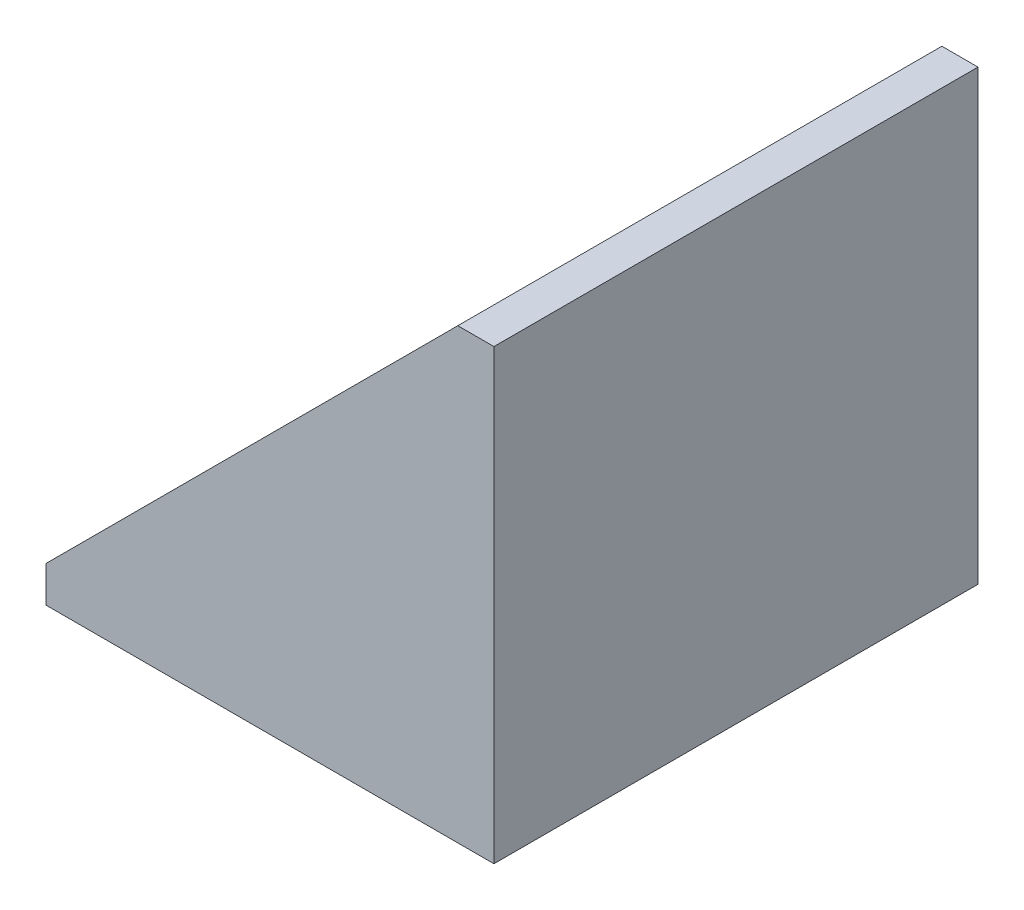
ISO-10303-21;
HEADER;
FILE_DESCRIPTION(('STEP AP214'),'2;1');
FILE_NAME('part.step','',(''),(''),'','','');
FILE_SCHEMA(('AUTOMOTIVE_DESIGN { 1 0 10303 214 1 1 1 1 }'));
ENDSEC;
DATA;
#1=APPLICATION_CONTEXT('core data for automotive mechanical design processes');
#2=APPLICATION_PROTOCOL_DEFINITION('international standard','automotive_design',2000,#1);
#3=PRODUCT_CONTEXT('',#1,'mechanical');
#4=PRODUCT('Part','Part','',(#3));
#5=PRODUCT_RELATED_PRODUCT_CATEGORY('part','',(#4));
#6=PRODUCT_DEFINITION_FORMATION('','',#4);
#7=PRODUCT_DEFINITION_CONTEXT('part definition',#1,'design');
#8=PRODUCT_DEFINITION('design','',#6,#7);
#9=PRODUCT_DEFINITION_SHAPE('','',#8);
#10=(LENGTH_UNIT() NAMED_UNIT(*) SI_UNIT(.MILLI.,.METRE.));
#11=(NAMED_UNIT(*) PLANE_ANGLE_UNIT() SI_UNIT($,.RADIAN.));
#12=(NAMED_UNIT(*) SI_UNIT($,.STERADIAN.) SOLID_ANGLE_UNIT());
#13=UNCERTAINTY_MEASURE_WITH_UNIT(LENGTH_MEASURE(1.E-05),#10,'distance_accuracy_value','');
#14=(GEOMETRIC_REPRESENTATION_CONTEXT(3) GLOBAL_UNCERTAINTY_ASSIGNED_CONTEXT((#13)) GLOBAL_UNIT_ASSIGNED_CONTEXT((#10,
#11,#12)) REPRESENTATION_CONTEXT('',''));
#15=CARTESIAN_POINT('',(0.,0.,0.));
#16=DIRECTION('',(0.,0.,1.));
#17=DIRECTION('',(1.,0.,0.));
#18=AXIS2_PLACEMENT_3D('',#15,#16,#17);
#19=CARTESIAN_POINT('',(0.,5.,0.));
#20=DIRECTION('',(0.,-1.,0.));
#21=DIRECTION('',(0.,0.,-1.));
#22=AXIS2_PLACEMENT_3D('',#19,#20,#21);
#23=PLANE('',#22);
#24=DIRECTION('',(0.,0.,-1.));
#25=VECTOR('',#24,1.);
#26=CARTESIAN_POINT('',(28.5,5.,28.5));
#27=LINE('',#26,#25);
#28=CARTESIAN_POINT('',(28.5,5.,28.5));
#29=VERTEX_POINT('',#28);
#30=CARTESIAN_POINT('',(28.5,5.,-28.5));
#31=VERTEX_POINT('',#30);
#32=EDGE_CURVE('E199',#29,#31,#27,.T.);
#33=ORIENTED_EDGE('',*,*,#32,.T.);
#34=DIRECTION('',(-1.,0.,0.));
#35=VECTOR('',#34,1.);
#36=CARTESIAN_POINT('',(-28.5,5.,-28.5));
#37=LINE('',#36,#35);
#38=CARTESIAN_POINT('',(-28.5,5.,-28.5));
#39=VERTEX_POINT('',#38);
#40=EDGE_CURVE('E49',#31,#39,#37,.T.);
#41=ORIENTED_EDGE('',*,*,#40,.T.);
#42=DIRECTION('',(0.,0.,1.));
#43=VECTOR('',#42,1.);
#44=CARTESIAN_POINT('',(-28.5,5.,28.5));
#45=LINE('',#44,#43);
#46=CARTESIAN_POINT('',(-28.5,5.,28.5));
#47=VERTEX_POINT('',#46);
#48=EDGE_CURVE('E42',#39,#47,#45,.T.);
#49=ORIENTED_EDGE('',*,*,#48,.T.);
#50=DIRECTION('',(1.,0.,0.));
#51=VECTOR('',#50,1.);
#52=CARTESIAN_POINT('',(-28.5,5.,28.5));
#53=LINE('',#52,#51);
#54=EDGE_CURVE('E11',#47,#29,#53,.T.);
#55=ORIENTED_EDGE('',*,*,#54,.T.);
#56=EDGE_LOOP('',(#33,#41,#49,#55));
#57=FACE_BOUND('',#56,.T.);
#58=CARTESIAN_POINT('',(-23.55,5.,-23.55));
#59=DIRECTION('',(0.,1.,0.));
#60=DIRECTION('',(0.,0.,1.));
#61=AXIS2_PLACEMENT_3D('',#58,#59,#60);
#62=CIRCLE('',#61,2.5);
#63=CARTESIAN_POINT('',(-23.55,5.,-21.05));
#64=VERTEX_POINT('',#63);
#65=EDGE_CURVE('E194',#64,#64,#62,.T.);
#66=ORIENTED_EDGE('',*,*,#65,.F.);
#67=EDGE_LOOP('',(#66));
#68=FACE_BOUND('',#67,.T.);
#69=CARTESIAN_POINT('',(0.,5.,0.));
#70=DIRECTION('',(0.,1.,0.));
#71=DIRECTION('',(0.,0.,1.));
#72=AXIS2_PLACEMENT_3D('',#69,#70,#71);
#73=CIRCLE('',#72,19.2);
#74=CARTESIAN_POINT('',(0.,5.,19.2));
#75=VERTEX_POINT('',#74);
#76=EDGE_CURVE('E188',#75,#75,#73,.T.);
#77=ORIENTED_EDGE('',*,*,#76,.F.);
#78=EDGE_LOOP('',(#77));
#79=FACE_BOUND('',#78,.T.);
#80=CARTESIAN_POINT('',(23.55,5.,-23.5500000000013));
#81=DIRECTION('',(0.,1.,0.));
#82=DIRECTION('',(0.,0.,1.));
#83=AXIS2_PLACEMENT_3D('',#80,#81,#82);
#84=CIRCLE('',#83,2.5);
#85=CARTESIAN_POINT('',(23.55,5.,-21.0500000000013));
#86=VERTEX_POINT('',#85);
#87=EDGE_CURVE('E182',#86,#86,#84,.T.);
#88=ORIENTED_EDGE('',*,*,#87,.F.);
#89=EDGE_LOOP('',(#88));
#90=FACE_BOUND('',#89,.T.);
#91=CARTESIAN_POINT('',(23.5500000000013,5.,23.5499999999987));
#92=DIRECTION('',(0.,1.,0.));
#93=DIRECTION('',(0.,0.,1.));
#94=AXIS2_PLACEMENT_3D('',#91,#92,#93);
#95=CIRCLE('',#94,2.5);
#96=CARTESIAN_POINT('',(23.5500000000013,5.,26.0499999999987));
#97=VERTEX_POINT('',#96);
#98=EDGE_CURVE('E176',#97,#97,#95,.T.);
#99=ORIENTED_EDGE('',*,*,#98,.F.);
#100=EDGE_LOOP('',(#99));
#101=FACE_BOUND('',#100,.T.);
#102=CARTESIAN_POINT('',(-23.5499999999987,5.,23.55));
#103=DIRECTION('',(0.,1.,0.));
#104=DIRECTION('',(0.,0.,1.));
#105=AXIS2_PLACEMENT_3D('',#102,#103,#104);
#106=CIRCLE('',#105,2.5);
#107=CARTESIAN_POINT('',(-23.5499999999987,5.,26.05));
#108=VERTEX_POINT('',#107);
#109=EDGE_CURVE('E170',#108,#108,#106,.T.);
#110=ORIENTED_EDGE('',*,*,#109,.F.);
#111=EDGE_LOOP('',(#110));
#112=FACE_BOUND('',#111,.T.);
#113=ADVANCED_FACE('F33',(#57,#68,#79,#90,#101,#112),#23,.F.);
#114=CARTESIAN_POINT('',(0.,0.,0.));
#115=DIRECTION('',(0.,-1.,0.));
#116=DIRECTION('',(0.,0.,-1.));
#117=AXIS2_PLACEMENT_3D('',#114,#115,#116);
#118=PLANE('',#117);
#119=CARTESIAN_POINT('',(23.5500000000013,0.,23.5499999999987));
#120=DIRECTION('',(0.,1.,0.));
#121=DIRECTION('',(0.,0.,1.));
#122=AXIS2_PLACEMENT_3D('',#119,#120,#121);
#123=CIRCLE('',#122,2.5);
#124=CARTESIAN_POINT('',(23.5500000000013,0.,26.0499999999987));
#125=VERTEX_POINT('',#124);
#126=EDGE_CURVE('E173',#125,#125,#123,.T.);
#127=ORIENTED_EDGE('',*,*,#126,.T.);
#128=EDGE_LOOP('',(#127));
#129=FACE_BOUND('',#128,.T.);
#130=CARTESIAN_POINT('',(0.,0.,0.));
#131=DIRECTION('',(0.,1.,0.));
#132=DIRECTION('',(0.,0.,1.));
#133=AXIS2_PLACEMENT_3D('',#130,#131,#132);
#134=CIRCLE('',#133,19.2);
#135=CARTESIAN_POINT('',(0.,0.,19.2));
#136=VERTEX_POINT('',#135);
#137=EDGE_CURVE('E185',#136,#136,#134,.T.);
#138=ORIENTED_EDGE('',*,*,#137,.T.);
#139=EDGE_LOOP('',(#138));
#140=FACE_BOUND('',#139,.T.);
#141=DIRECTION('',(0.,0.,1.));
#142=VECTOR('',#141,1.);
#143=CARTESIAN_POINT('',(-28.5,0.,28.5));
#144=LINE('',#143,#142);
#145=CARTESIAN_POINT('',(-28.5,0.,-33.5));
#146=VERTEX_POINT('',#145);
#147=CARTESIAN_POINT('',(-28.5,0.,33.5));
#148=VERTEX_POINT('',#147);
#149=EDGE_CURVE('E37',#146,#148,#144,.T.);
#150=ORIENTED_EDGE('',*,*,#149,.F.);
#151=DIRECTION('',(1.,0.,0.));
#152=VECTOR('',#151,1.);
#153=CARTESIAN_POINT('',(-28.5,0.,-33.5));
#154=LINE('',#153,#152);
#155=CARTESIAN_POINT('',(33.5,0.,-33.5));
#156=VERTEX_POINT('',#155);
#157=EDGE_CURVE('E133',#146,#156,#154,.T.);
#158=ORIENTED_EDGE('',*,*,#157,.T.);
#159=DIRECTION('',(0.,0.,1.));
#160=VECTOR('',#159,1.);
#161=CARTESIAN_POINT('',(33.5,0.,-90.7012861603359));
#162=LINE('',#161,#160);
#163=CARTESIAN_POINT('',(33.5,0.,33.5));
#164=VERTEX_POINT('',#163);
#165=EDGE_CURVE('E166',#156,#164,#162,.T.);
#166=ORIENTED_EDGE('',*,*,#165,.T.);
#167=DIRECTION('',(1.,0.,0.));
#168=VECTOR('',#167,1.);
#169=CARTESIAN_POINT('',(-28.5,0.,33.5));
#170=LINE('',#169,#168);
#171=EDGE_CURVE('E147',#148,#164,#170,.T.);
#172=ORIENTED_EDGE('',*,*,#171,.F.);
#173=EDGE_LOOP('',(#150,#158,#166,#172));
#174=FACE_BOUND('',#173,.T.);
#175=CARTESIAN_POINT('',(-23.55,0.,-23.55));
#176=DIRECTION('',(0.,1.,0.));
#177=DIRECTION('',(0.,0.,1.));
#178=AXIS2_PLACEMENT_3D('',#175,#176,#177);
#179=CIRCLE('',#178,2.5);
#180=CARTESIAN_POINT('',(-23.55,0.,-21.05));
#181=VERTEX_POINT('',#180);
#182=EDGE_CURVE('E191',#181,#181,#179,.T.);
#183=ORIENTED_EDGE('',*,*,#182,.T.);
#184=EDGE_LOOP('',(#183));
#185=FACE_BOUND('',#184,.T.);
#186=CARTESIAN_POINT('',(23.55,0.,-23.5500000000013));
#187=DIRECTION('',(0.,1.,0.));
#188=DIRECTION('',(0.,0.,1.));
#189=AXIS2_PLACEMENT_3D('',#186,#187,#188);
#190=CIRCLE('',#189,2.5);
#191=CARTESIAN_POINT('',(23.55,0.,-21.0500000000013));
#192=VERTEX_POINT('',#191);
#193=EDGE_CURVE('E179',#192,#192,#190,.T.);
#194=ORIENTED_EDGE('',*,*,#193,.T.);
#195=EDGE_LOOP('',(#194));
#196=FACE_BOUND('',#195,.T.);
#197=CARTESIAN_POINT('',(-23.5499999999987,0.,23.55));
#198=DIRECTION('',(0.,1.,0.));
#199=DIRECTION('',(0.,0.,1.));
#200=AXIS2_PLACEMENT_3D('',#197,#198,#199);
#201=CIRCLE('',#200,2.5);
#202=CARTESIAN_POINT('',(-23.5499999999987,0.,26.05));
#203=VERTEX_POINT('',#202);
#204=EDGE_CURVE('E163',#203,#203,#201,.T.);
#205=ORIENTED_EDGE('',*,*,#204,.T.);
#206=EDGE_LOOP('',(#205));
#207=FACE_BOUND('',#206,.T.);
#208=ADVANCED_FACE('F221',(#129,#140,#174,#185,#196,#207),#118,.T.);
#209=CARTESIAN_POINT('',(-28.5,5.,28.5));
#210=DIRECTION('',(1.,0.,0.));
#211=DIRECTION('',(0.,0.,-1.));
#212=AXIS2_PLACEMENT_3D('',#209,#210,#211);
#213=PLANE('',#212);
#214=ORIENTED_EDGE('',*,*,#149,.T.);
#215=DIRECTION('',(0.,-1.,0.));
#216=VECTOR('',#215,1.);
#217=CARTESIAN_POINT('',(-28.5,5.,33.5));
#218=LINE('',#217,#216);
#219=CARTESIAN_POINT('',(-28.5,5.,33.5));
#220=VERTEX_POINT('',#219);
#221=EDGE_CURVE('E144',#220,#148,#218,.T.);
#222=ORIENTED_EDGE('',*,*,#221,.F.);
#223=DIRECTION('',(0.,0.,-1.));
#224=VECTOR('',#223,1.);
#225=CARTESIAN_POINT('',(-28.5,5.,33.5));
#226=LINE('',#225,#224);
#227=EDGE_CURVE('E153',#220,#47,#226,.T.);
#228=ORIENTED_EDGE('',*,*,#227,.T.);
#229=ORIENTED_EDGE('',*,*,#48,.F.);
#230=DIRECTION('',(0.,0.,1.));
#231=VECTOR('',#230,1.);
#232=CARTESIAN_POINT('',(-28.5,5.,-33.5));
#233=LINE('',#232,#231);
#234=CARTESIAN_POINT('',(-28.5,5.,-33.5));
#235=VERTEX_POINT('',#234);
#236=EDGE_CURVE('E112',#235,#39,#233,.T.);
#237=ORIENTED_EDGE('',*,*,#236,.F.);
#238=DIRECTION('',(0.,-1.,0.));
#239=VECTOR('',#238,1.);
#240=CARTESIAN_POINT('',(-28.5,5.,-33.5));
#241=LINE('',#240,#239);
#242=EDGE_CURVE('E124',#235,#146,#241,.T.);
#243=ORIENTED_EDGE('',*,*,#242,.T.);
#244=EDGE_LOOP('',(#214,#222,#228,#229,#237,#243));
#245=FACE_BOUND('',#244,.T.);
#246=ADVANCED_FACE('F35',(#245),#213,.F.);
#247=CARTESIAN_POINT('',(-23.55,5.,-23.55));
#248=DIRECTION('',(0.,-1.,0.));
#249=DIRECTION('',(0.,0.,-1.));
#250=AXIS2_PLACEMENT_3D('',#247,#248,#249);
#251=CYLINDRICAL_SURFACE('',#250,2.5);
#252=ORIENTED_EDGE('',*,*,#65,.T.);
#253=EDGE_LOOP('',(#252));
#254=FACE_BOUND('',#253,.T.);
#255=ORIENTED_EDGE('',*,*,#182,.F.);
#256=EDGE_LOOP('',(#255));
#257=FACE_BOUND('',#256,.T.);
#258=ADVANCED_FACE('F228',(#254,#257),#251,.F.);
#259=CARTESIAN_POINT('',(0.,5.,0.));
#260=DIRECTION('',(0.,-1.,0.));
#261=DIRECTION('',(0.,0.,-1.));
#262=AXIS2_PLACEMENT_3D('',#259,#260,#261);
#263=CYLINDRICAL_SURFACE('',#262,19.2);
#264=ORIENTED_EDGE('',*,*,#76,.T.);
#265=EDGE_LOOP('',(#264));
#266=FACE_BOUND('',#265,.T.);
#267=ORIENTED_EDGE('',*,*,#137,.F.);
#268=EDGE_LOOP('',(#267));
#269=FACE_BOUND('',#268,.T.);
#270=ADVANCED_FACE('F231',(#266,#269),#263,.F.);
#271=CARTESIAN_POINT('',(23.55,5.,-23.5500000000013));
#272=DIRECTION('',(0.,-1.,0.));
#273=DIRECTION('',(0.,0.,-1.));
#274=AXIS2_PLACEMENT_3D('',#271,#272,#273);
#275=CYLINDRICAL_SURFACE('',#274,2.5);
#276=ORIENTED_EDGE('',*,*,#87,.T.);
#277=EDGE_LOOP('',(#276));
#278=FACE_BOUND('',#277,.T.);
#279=ORIENTED_EDGE('',*,*,#193,.F.);
#280=EDGE_LOOP('',(#279));
#281=FACE_BOUND('',#280,.T.);
#282=ADVANCED_FACE('F235',(#278,#281),#275,.F.);
#283=CARTESIAN_POINT('',(23.5500000000013,5.,23.5499999999987));
#284=DIRECTION('',(0.,-1.,0.));
#285=DIRECTION('',(0.,0.,-1.));
#286=AXIS2_PLACEMENT_3D('',#283,#284,#285);
#287=CYLINDRICAL_SURFACE('',#286,2.5);
#288=ORIENTED_EDGE('',*,*,#98,.T.);
#289=EDGE_LOOP('',(#288));
#290=FACE_BOUND('',#289,.T.);
#291=ORIENTED_EDGE('',*,*,#126,.F.);
#292=EDGE_LOOP('',(#291));
#293=FACE_BOUND('',#292,.T.);
#294=ADVANCED_FACE('F239',(#290,#293),#287,.F.);
#295=CARTESIAN_POINT('',(-23.5499999999987,5.,23.55));
#296=DIRECTION('',(0.,-1.,0.));
#297=DIRECTION('',(0.,0.,-1.));
#298=AXIS2_PLACEMENT_3D('',#295,#296,#297);
#299=CYLINDRICAL_SURFACE('',#298,2.5);
#300=ORIENTED_EDGE('',*,*,#109,.T.);
#301=EDGE_LOOP('',(#300));
#302=FACE_BOUND('',#301,.T.);
#303=ORIENTED_EDGE('',*,*,#204,.F.);
#304=EDGE_LOOP('',(#303));
#305=FACE_BOUND('',#304,.T.);
#306=ADVANCED_FACE('F243',(#302,#305),#299,.F.);
#307=CARTESIAN_POINT('',(28.5,62.,-90.7012861603359));
#308=DIRECTION('',(-1.,0.,0.));
#309=DIRECTION('',(0.,0.,1.));
#310=AXIS2_PLACEMENT_3D('',#307,#308,#309);
#311=PLANE('',#310);
#312=ORIENTED_EDGE('',*,*,#32,.F.);
#313=DIRECTION('',(0.,-1.,0.));
#314=VECTOR('',#313,1.);
#315=CARTESIAN_POINT('',(28.5,62.,28.5));
#316=LINE('',#315,#314);
#317=CARTESIAN_POINT('',(28.5,62.,28.5));
#318=VERTEX_POINT('',#317);
#319=EDGE_CURVE('E161',#318,#29,#316,.T.);
#320=ORIENTED_EDGE('',*,*,#319,.F.);
#321=DIRECTION('',(0.,0.,1.));
#322=VECTOR('',#321,1.);
#323=CARTESIAN_POINT('',(28.5,62.,-90.7012861603359));
#324=LINE('',#323,#322);
#325=CARTESIAN_POINT('',(28.5,62.,-28.5));
#326=VERTEX_POINT('',#325);
#327=EDGE_CURVE('E164',#326,#318,#324,.T.);
#328=ORIENTED_EDGE('',*,*,#327,.F.);
#329=DIRECTION('',(0.,1.,0.));
#330=VECTOR('',#329,1.);
#331=CARTESIAN_POINT('',(28.5,62.,-28.5));
#332=LINE('',#331,#330);
#333=EDGE_CURVE('E57',#31,#326,#332,.T.);
#334=ORIENTED_EDGE('',*,*,#333,.F.);
#335=EDGE_LOOP('',(#312,#320,#328,#334));
#336=FACE_BOUND('',#335,.T.);
#337=ADVANCED_FACE('F247',(#336),#311,.T.);
#338=CARTESIAN_POINT('',(28.5,62.,-90.7012861603359));
#339=DIRECTION('',(0.,1.,0.));
#340=DIRECTION('',(0.,0.,1.));
#341=AXIS2_PLACEMENT_3D('',#338,#339,#340);
#342=PLANE('',#341);
#343=DIRECTION('',(0.,0.,1.));
#344=VECTOR('',#343,1.);
#345=CARTESIAN_POINT('',(33.5,62.,-90.7012861603359));
#346=LINE('',#345,#344);
#347=CARTESIAN_POINT('',(33.5,62.,-33.5));
#348=VERTEX_POINT('',#347);
#349=CARTESIAN_POINT('',(33.5,62.,33.5));
#350=VERTEX_POINT('',#349);
#351=EDGE_CURVE('E128',#348,#350,#346,.T.);
#352=ORIENTED_EDGE('',*,*,#351,.F.);
#353=DIRECTION('',(-1.,0.,0.));
#354=VECTOR('',#353,1.);
#355=CARTESIAN_POINT('',(33.5,62.,-33.5));
#356=LINE('',#355,#354);
#357=CARTESIAN_POINT('',(28.5,62.,-33.5));
#358=VERTEX_POINT('',#357);
#359=EDGE_CURVE('E120',#348,#358,#356,.T.);
#360=ORIENTED_EDGE('',*,*,#359,.T.);
#361=DIRECTION('',(0.,0.,1.));
#362=VECTOR('',#361,1.);
#363=CARTESIAN_POINT('',(28.5,62.,-33.5));
#364=LINE('',#363,#362);
#365=EDGE_CURVE('E102',#358,#326,#364,.T.);
#366=ORIENTED_EDGE('',*,*,#365,.T.);
#367=ORIENTED_EDGE('',*,*,#327,.T.);
#368=DIRECTION('',(0.,0.,-1.));
#369=VECTOR('',#368,1.);
#370=CARTESIAN_POINT('',(28.5,62.,33.5));
#371=LINE('',#370,#369);
#372=CARTESIAN_POINT('',(28.5,62.,33.5));
#373=VERTEX_POINT('',#372);
#374=EDGE_CURVE('E158',#373,#318,#371,.T.);
#375=ORIENTED_EDGE('',*,*,#374,.F.);
#376=DIRECTION('',(-1.,0.,0.));
#377=VECTOR('',#376,1.);
#378=CARTESIAN_POINT('',(33.5,62.,33.5));
#379=LINE('',#378,#377);
#380=EDGE_CURVE('E139',#350,#373,#379,.T.);
#381=ORIENTED_EDGE('',*,*,#380,.F.);
#382=EDGE_LOOP('',(#352,#360,#366,#367,#375,#381));
#383=FACE_BOUND('',#382,.T.);
#384=ADVANCED_FACE('F126',(#383),#342,.T.);
#385=CARTESIAN_POINT('',(33.5,62.,-90.7012861603359));
#386=DIRECTION('',(1.,0.,0.));
#387=DIRECTION('',(0.,1.,0.));
#388=AXIS2_PLACEMENT_3D('',#385,#386,#387);
#389=PLANE('',#388);
#390=ORIENTED_EDGE('',*,*,#165,.F.);
#391=DIRECTION('',(0.,1.,0.));
#392=VECTOR('',#391,1.);
#393=CARTESIAN_POINT('',(33.5,0.,-33.5));
#394=LINE('',#393,#392);
#395=EDGE_CURVE('E113',#156,#348,#394,.T.);
#396=ORIENTED_EDGE('',*,*,#395,.T.);
#397=ORIENTED_EDGE('',*,*,#351,.T.);
#398=DIRECTION('',(0.,1.,0.));
#399=VECTOR('',#398,1.);
#400=CARTESIAN_POINT('',(33.5,0.,33.5));
#401=LINE('',#400,#399);
#402=EDGE_CURVE('E150',#164,#350,#401,.T.);
#403=ORIENTED_EDGE('',*,*,#402,.F.);
#404=EDGE_LOOP('',(#390,#396,#397,#403));
#405=FACE_BOUND('',#404,.T.);
#406=ADVANCED_FACE('F251',(#405),#389,.T.);
#407=CARTESIAN_POINT('',(0.,0.,28.5));
#408=DIRECTION('',(0.,0.,1.));
#409=DIRECTION('',(1.,0.,0.));
#410=AXIS2_PLACEMENT_3D('',#407,#408,#409);
#411=PLANE('',#410);
#412=DIRECTION('',(-0.707106781186548,-0.707106781186548,0.));
#413=VECTOR('',#412,1.);
#414=CARTESIAN_POINT('',(28.5,62.,28.5));
#415=LINE('',#414,#413);
#416=EDGE_CURVE('E137',#318,#47,#415,.T.);
#417=ORIENTED_EDGE('',*,*,#416,.F.);
#418=ORIENTED_EDGE('',*,*,#319,.T.);
#419=ORIENTED_EDGE('',*,*,#54,.F.);
#420=EDGE_LOOP('',(#417,#418,#419));
#421=FACE_BOUND('',#420,.T.);
#422=ADVANCED_FACE('F254',(#421),#411,.F.);
#423=CARTESIAN_POINT('',(28.5,62.,33.5));
#424=DIRECTION('',(0.707106781186548,-0.707106781186548,0.));
#425=DIRECTION('',(0.707106781186548,0.707106781186548,0.));
#426=AXIS2_PLACEMENT_3D('',#423,#424,#425);
#427=PLANE('',#426);
#428=ORIENTED_EDGE('',*,*,#416,.T.);
#429=ORIENTED_EDGE('',*,*,#227,.F.);
#430=DIRECTION('',(-0.707106781186548,-0.707106781186548,0.));
#431=VECTOR('',#430,1.);
#432=CARTESIAN_POINT('',(28.5,62.,33.5));
#433=LINE('',#432,#431);
#434=EDGE_CURVE('E142',#373,#220,#433,.T.);
#435=ORIENTED_EDGE('',*,*,#434,.F.);
#436=ORIENTED_EDGE('',*,*,#374,.T.);
#437=EDGE_LOOP('',(#428,#429,#435,#436));
#438=FACE_BOUND('',#437,.T.);
#439=ADVANCED_FACE('F216',(#438),#427,.F.);
#440=CARTESIAN_POINT('',(0.,0.,33.5));
#441=DIRECTION('',(0.,0.,1.));
#442=DIRECTION('',(1.,0.,0.));
#443=AXIS2_PLACEMENT_3D('',#440,#441,#442);
#444=PLANE('',#443);
#445=ORIENTED_EDGE('',*,*,#380,.T.);
#446=ORIENTED_EDGE('',*,*,#434,.T.);
#447=ORIENTED_EDGE('',*,*,#221,.T.);
#448=ORIENTED_EDGE('',*,*,#171,.T.);
#449=ORIENTED_EDGE('',*,*,#402,.T.);
#450=EDGE_LOOP('',(#445,#446,#447,#448,#449));
#451=FACE_BOUND('',#450,.T.);
#452=ADVANCED_FACE('F209',(#451),#444,.T.);
#453=CARTESIAN_POINT('',(0.,0.,-28.5));
#454=DIRECTION('',(0.,0.,1.));
#455=DIRECTION('',(1.,0.,0.));
#456=AXIS2_PLACEMENT_3D('',#453,#454,#455);
#457=PLANE('',#456);
#458=ORIENTED_EDGE('',*,*,#40,.F.);
#459=ORIENTED_EDGE('',*,*,#333,.T.);
#460=DIRECTION('',(-0.707106781186548,-0.707106781186548,0.));
#461=VECTOR('',#460,1.);
#462=CARTESIAN_POINT('',(28.5,62.,-28.5));
#463=LINE('',#462,#461);
#464=EDGE_CURVE('E108',#326,#39,#463,.T.);
#465=ORIENTED_EDGE('',*,*,#464,.T.);
#466=EDGE_LOOP('',(#458,#459,#465));
#467=FACE_BOUND('',#466,.T.);
#468=ADVANCED_FACE('F207',(#467),#457,.T.);
#469=CARTESIAN_POINT('',(28.5,62.,-33.5));
#470=DIRECTION('',(-0.707106781186548,0.707106781186548,0.));
#471=DIRECTION('',(-0.707106781186548,-0.707106781186548,0.));
#472=AXIS2_PLACEMENT_3D('',#469,#470,#471);
#473=PLANE('',#472);
#474=ORIENTED_EDGE('',*,*,#464,.F.);
#475=ORIENTED_EDGE('',*,*,#365,.F.);
#476=DIRECTION('',(-0.707106781186548,-0.707106781186548,0.));
#477=VECTOR('',#476,1.);
#478=CARTESIAN_POINT('',(28.5,62.,-33.5));
#479=LINE('',#478,#477);
#480=EDGE_CURVE('E106',#358,#235,#479,.T.);
#481=ORIENTED_EDGE('',*,*,#480,.T.);
#482=ORIENTED_EDGE('',*,*,#236,.T.);
#483=EDGE_LOOP('',(#474,#475,#481,#482));
#484=FACE_BOUND('',#483,.T.);
#485=ADVANCED_FACE('F104',(#484),#473,.T.);
#486=CARTESIAN_POINT('',(0.,0.,-33.5));
#487=DIRECTION('',(0.,0.,1.));
#488=DIRECTION('',(1.,0.,0.));
#489=AXIS2_PLACEMENT_3D('',#486,#487,#488);
#490=PLANE('',#489);
#491=ORIENTED_EDGE('',*,*,#359,.F.);
#492=ORIENTED_EDGE('',*,*,#395,.F.);
#493=ORIENTED_EDGE('',*,*,#157,.F.);
#494=ORIENTED_EDGE('',*,*,#242,.F.);
#495=ORIENTED_EDGE('',*,*,#480,.F.);
#496=EDGE_LOOP('',(#491,#492,#493,#494,#495));
#497=FACE_BOUND('',#496,.T.);
#498=ADVANCED_FACE('F118',(#497),#490,.F.);
#499=CLOSED_SHELL('',(#113,#208,#246,#258,#270,#282,#294,#306,#337,#384,#406,#422,#439,#452,
#468,#485,#498));
#500=MANIFOLD_SOLID_BREP('B2',#499);
#501=ADVANCED_BREP_SHAPE_REPRESENTATION('',(#18,#500),#14);
#502=SHAPE_DEFINITION_REPRESENTATION(#9,#501);
ENDSEC;
END-ISO-10303-21;
